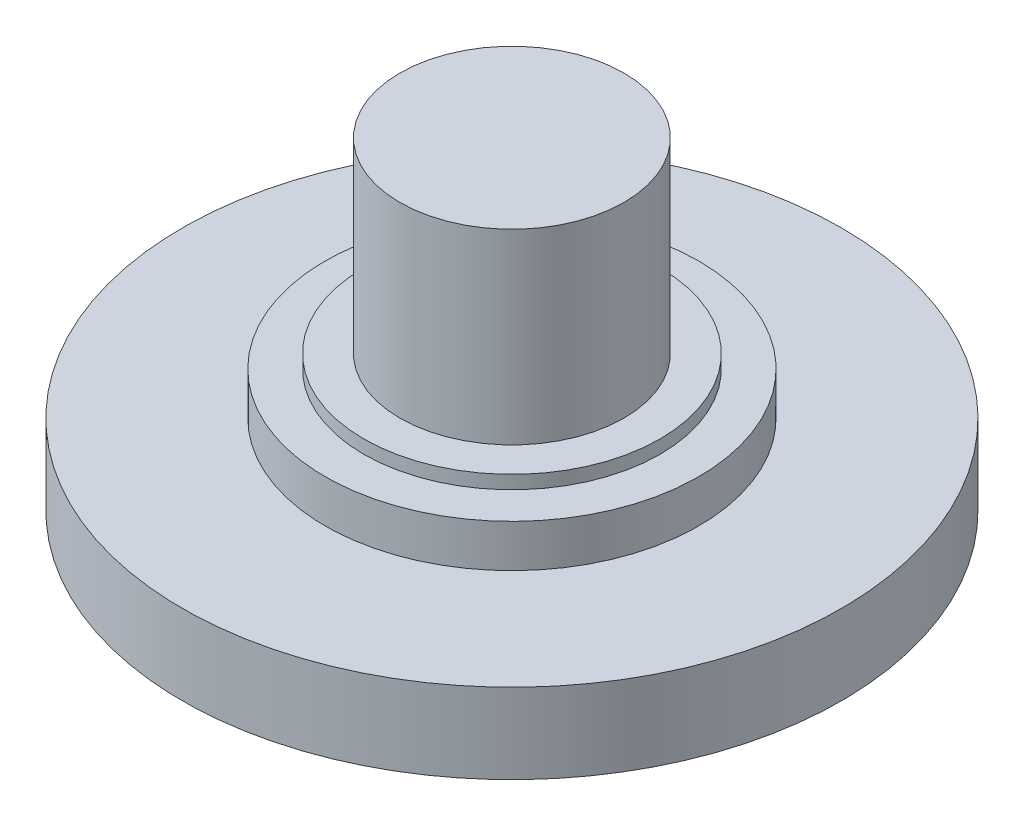
ISO-10303-21;
HEADER;
FILE_DESCRIPTION(('STEP AP214'),'2;1');
FILE_NAME('part.step','',(''),(''),'','','');
FILE_SCHEMA(('AUTOMOTIVE_DESIGN { 1 0 10303 214 1 1 1 1 }'));
ENDSEC;
DATA;
#1=APPLICATION_CONTEXT('core data for automotive mechanical design processes');
#2=APPLICATION_PROTOCOL_DEFINITION('international standard','automotive_design',2000,#1);
#3=PRODUCT_CONTEXT('',#1,'mechanical');
#4=PRODUCT('Part','Part','',(#3));
#5=PRODUCT_RELATED_PRODUCT_CATEGORY('part','',(#4));
#6=PRODUCT_DEFINITION_FORMATION('','',#4);
#7=PRODUCT_DEFINITION_CONTEXT('part definition',#1,'design');
#8=PRODUCT_DEFINITION('design','',#6,#7);
#9=PRODUCT_DEFINITION_SHAPE('','',#8);
#10=(LENGTH_UNIT() NAMED_UNIT(*) SI_UNIT(.MILLI.,.METRE.));
#11=(NAMED_UNIT(*) PLANE_ANGLE_UNIT() SI_UNIT($,.RADIAN.));
#12=(NAMED_UNIT(*) SI_UNIT($,.STERADIAN.) SOLID_ANGLE_UNIT());
#13=UNCERTAINTY_MEASURE_WITH_UNIT(LENGTH_MEASURE(1.E-05),#10,'distance_accuracy_value','');
#14=(GEOMETRIC_REPRESENTATION_CONTEXT(3) GLOBAL_UNCERTAINTY_ASSIGNED_CONTEXT((#13)) GLOBAL_UNIT_ASSIGNED_CONTEXT((#10,
#11,#12)) REPRESENTATION_CONTEXT('',''));
#15=CARTESIAN_POINT('',(0.,0.,0.));
#16=DIRECTION('',(0.,0.,1.));
#17=DIRECTION('',(1.,0.,0.));
#18=AXIS2_PLACEMENT_3D('',#15,#16,#17);
#19=CARTESIAN_POINT('',(18.6367599502443,-44.6805647840532,0.));
#20=DIRECTION('',(0.,1.,0.));
#21=DIRECTION('',(0.,0.,1.));
#22=AXIS2_PLACEMENT_3D('',#19,#20,#21);
#23=PLANE('',#22);
#24=CARTESIAN_POINT('',(0.,-44.6805647840532,0.));
#25=DIRECTION('',(0.,-1.,0.));
#26=DIRECTION('',(0.,0.,-1.));
#27=AXIS2_PLACEMENT_3D('',#24,#25,#26);
#28=CIRCLE('',#27,18.6367599502443);
#29=CARTESIAN_POINT('',(0.,-44.6805647840532,-18.6367599502443));
#30=VERTEX_POINT('',#29);
#31=EDGE_CURVE('E10',#30,#30,#28,.T.);
#32=ORIENTED_EDGE('',*,*,#31,.T.);
#33=EDGE_LOOP('',(#32));
#34=FACE_BOUND('',#33,.T.);
#35=ADVANCED_FACE('F36',(#34),#23,.F.);
#36=CARTESIAN_POINT('',(0.,-62.1805647840532,0.));
#37=DIRECTION('',(0.,-1.,0.));
#38=DIRECTION('',(0.,0.,-1.));
#39=AXIS2_PLACEMENT_3D('',#36,#37,#38);
#40=CONICAL_SURFACE('',#39,23.,0.244346095279207);
#41=ORIENTED_EDGE('',*,*,#31,.F.);
#42=EDGE_LOOP('',(#41));
#43=FACE_BOUND('',#42,.T.);
#44=CARTESIAN_POINT('',(0.,-62.1805647840532,0.));
#45=DIRECTION('',(0.,-1.,0.));
#46=DIRECTION('',(0.,0.,-1.));
#47=AXIS2_PLACEMENT_3D('',#44,#45,#46);
#48=CIRCLE('',#47,23.);
#49=CARTESIAN_POINT('',(0.,-62.1805647840532,-23.));
#50=VERTEX_POINT('',#49);
#51=EDGE_CURVE('E44',#50,#50,#48,.T.);
#52=ORIENTED_EDGE('',*,*,#51,.T.);
#53=EDGE_LOOP('',(#52));
#54=FACE_BOUND('',#53,.T.);
#55=ADVANCED_FACE('F177',(#43,#54),#40,.F.);
#56=CARTESIAN_POINT('',(30.,-62.1805647840532,0.));
#57=DIRECTION('',(0.,1.,0.));
#58=DIRECTION('',(0.,0.,1.));
#59=AXIS2_PLACEMENT_3D('',#56,#57,#58);
#60=PLANE('',#59);
#61=ORIENTED_EDGE('',*,*,#51,.F.);
#62=EDGE_LOOP('',(#61));
#63=FACE_BOUND('',#62,.T.);
#64=CARTESIAN_POINT('',(0.,-62.1805647840532,0.));
#65=DIRECTION('',(0.,-1.,0.));
#66=DIRECTION('',(0.,0.,-1.));
#67=AXIS2_PLACEMENT_3D('',#64,#65,#66);
#68=CIRCLE('',#67,30.);
#69=CARTESIAN_POINT('',(0.,-62.1805647840532,-30.));
#70=VERTEX_POINT('',#69);
#71=EDGE_CURVE('E48',#70,#70,#68,.T.);
#72=ORIENTED_EDGE('',*,*,#71,.T.);
#73=EDGE_LOOP('',(#72));
#74=FACE_BOUND('',#73,.T.);
#75=ADVANCED_FACE('F173',(#63,#74),#60,.F.);
#76=CARTESIAN_POINT('',(0.,-78.0635105204873,0.));
#77=DIRECTION('',(0.,-1.,0.));
#78=DIRECTION('',(0.,0.,-1.));
#79=AXIS2_PLACEMENT_3D('',#76,#77,#78);
#80=CYLINDRICAL_SURFACE('',#79,30.);
#81=ORIENTED_EDGE('',*,*,#71,.F.);
#82=EDGE_LOOP('',(#81));
#83=FACE_BOUND('',#82,.T.);
#84=CARTESIAN_POINT('',(0.,-47.1805647840532,0.));
#85=DIRECTION('',(0.,-1.,0.));
#86=DIRECTION('',(0.,0.,-1.));
#87=AXIS2_PLACEMENT_3D('',#84,#85,#86);
#88=CIRCLE('',#87,30.);
#89=CARTESIAN_POINT('',(0.,-47.1805647840532,-30.));
#90=VERTEX_POINT('',#89);
#91=EDGE_CURVE('E52',#90,#90,#88,.T.);
#92=ORIENTED_EDGE('',*,*,#91,.T.);
#93=EDGE_LOOP('',(#92));
#94=FACE_BOUND('',#93,.T.);
#95=ADVANCED_FACE('F169',(#83,#94),#80,.T.);
#96=CARTESIAN_POINT('',(34.,-47.1805647840532,0.));
#97=DIRECTION('',(0.,1.,0.));
#98=DIRECTION('',(0.,0.,1.));
#99=AXIS2_PLACEMENT_3D('',#96,#97,#98);
#100=PLANE('',#99);
#101=ORIENTED_EDGE('',*,*,#91,.F.);
#102=EDGE_LOOP('',(#101));
#103=FACE_BOUND('',#102,.T.);
#104=CARTESIAN_POINT('',(0.,-47.1805647840531,0.));
#105=DIRECTION('',(0.,-1.,0.));
#106=DIRECTION('',(0.,0.,-1.));
#107=AXIS2_PLACEMENT_3D('',#104,#105,#106);
#108=CIRCLE('',#107,34.);
#109=CARTESIAN_POINT('',(0.,-47.1805647840531,-34.));
#110=VERTEX_POINT('',#109);
#111=EDGE_CURVE('E57',#110,#110,#108,.T.);
#112=ORIENTED_EDGE('',*,*,#111,.T.);
#113=EDGE_LOOP('',(#112));
#114=FACE_BOUND('',#113,.T.);
#115=ADVANCED_FACE('F165',(#103,#114),#100,.F.);
#116=CARTESIAN_POINT('',(0.,-78.0635105204873,0.));
#117=DIRECTION('',(0.,-1.,0.));
#118=DIRECTION('',(0.,0.,-1.));
#119=AXIS2_PLACEMENT_3D('',#116,#117,#118);
#120=CYLINDRICAL_SURFACE('',#119,34.);
#121=ORIENTED_EDGE('',*,*,#111,.F.);
#122=EDGE_LOOP('',(#121));
#123=FACE_BOUND('',#122,.T.);
#124=CARTESIAN_POINT('',(0.,-41.1805647840531,0.));
#125=DIRECTION('',(0.,-1.,0.));
#126=DIRECTION('',(0.,0.,-1.));
#127=AXIS2_PLACEMENT_3D('',#124,#125,#126);
#128=CIRCLE('',#127,34.);
#129=CARTESIAN_POINT('',(0.,-41.1805647840531,-34.));
#130=VERTEX_POINT('',#129);
#131=EDGE_CURVE('E60',#130,#130,#128,.T.);
#132=ORIENTED_EDGE('',*,*,#131,.T.);
#133=EDGE_LOOP('',(#132));
#134=FACE_BOUND('',#133,.T.);
#135=ADVANCED_FACE('F161',(#123,#134),#120,.T.);
#136=CARTESIAN_POINT('',(61.75,-41.1805647840531,0.));
#137=DIRECTION('',(0.,1.,0.));
#138=DIRECTION('',(0.,0.,1.));
#139=AXIS2_PLACEMENT_3D('',#136,#137,#138);
#140=PLANE('',#139);
#141=ORIENTED_EDGE('',*,*,#131,.F.);
#142=EDGE_LOOP('',(#141));
#143=FACE_BOUND('',#142,.T.);
#144=CARTESIAN_POINT('',(0.,-41.1805647840531,0.));
#145=DIRECTION('',(0.,-1.,0.));
#146=DIRECTION('',(0.,0.,-1.));
#147=AXIS2_PLACEMENT_3D('',#144,#145,#146);
#148=CIRCLE('',#147,61.75);
#149=CARTESIAN_POINT('',(0.,-41.1805647840531,-61.75));
#150=VERTEX_POINT('',#149);
#151=EDGE_CURVE('E63',#150,#150,#148,.T.);
#152=ORIENTED_EDGE('',*,*,#151,.T.);
#153=EDGE_LOOP('',(#152));
#154=FACE_BOUND('',#153,.T.);
#155=ADVANCED_FACE('F157',(#143,#154),#140,.F.);
#156=CARTESIAN_POINT('',(0.,-78.0635105204873,0.));
#157=DIRECTION('',(0.,-1.,0.));
#158=DIRECTION('',(0.,0.,-1.));
#159=AXIS2_PLACEMENT_3D('',#156,#157,#158);
#160=CYLINDRICAL_SURFACE('',#159,61.75);
#161=ORIENTED_EDGE('',*,*,#151,.F.);
#162=EDGE_LOOP('',(#161));
#163=FACE_BOUND('',#162,.T.);
#164=CARTESIAN_POINT('',(0.,-26.1805647840531,0.));
#165=DIRECTION('',(0.,-1.,0.));
#166=DIRECTION('',(0.,0.,-1.));
#167=AXIS2_PLACEMENT_3D('',#164,#165,#166);
#168=CIRCLE('',#167,61.75);
#169=CARTESIAN_POINT('',(0.,-26.1805647840531,-61.75));
#170=VERTEX_POINT('',#169);
#171=EDGE_CURVE('E66',#170,#170,#168,.T.);
#172=ORIENTED_EDGE('',*,*,#171,.T.);
#173=EDGE_LOOP('',(#172));
#174=FACE_BOUND('',#173,.T.);
#175=ADVANCED_FACE('F153',(#163,#174),#160,.T.);
#176=CARTESIAN_POINT('',(35.,-26.1805647840531,0.));
#177=DIRECTION('',(0.,-1.,0.));
#178=DIRECTION('',(0.,0.,-1.));
#179=AXIS2_PLACEMENT_3D('',#176,#177,#178);
#180=PLANE('',#179);
#181=ORIENTED_EDGE('',*,*,#171,.F.);
#182=EDGE_LOOP('',(#181));
#183=FACE_BOUND('',#182,.T.);
#184=CARTESIAN_POINT('',(0.,-26.1805647840531,0.));
#185=DIRECTION('',(0.,-1.,0.));
#186=DIRECTION('',(0.,0.,-1.));
#187=AXIS2_PLACEMENT_3D('',#184,#185,#186);
#188=CIRCLE('',#187,35.);
#189=CARTESIAN_POINT('',(0.,-26.1805647840531,-35.));
#190=VERTEX_POINT('',#189);
#191=EDGE_CURVE('E69',#190,#190,#188,.T.);
#192=ORIENTED_EDGE('',*,*,#191,.T.);
#193=EDGE_LOOP('',(#192));
#194=FACE_BOUND('',#193,.T.);
#195=ADVANCED_FACE('F149',(#183,#194),#180,.F.);
#196=CARTESIAN_POINT('',(0.,-78.0635105204873,0.));
#197=DIRECTION('',(0.,-1.,0.));
#198=DIRECTION('',(0.,0.,-1.));
#199=AXIS2_PLACEMENT_3D('',#196,#197,#198);
#200=CYLINDRICAL_SURFACE('',#199,35.);
#201=ORIENTED_EDGE('',*,*,#191,.F.);
#202=EDGE_LOOP('',(#201));
#203=FACE_BOUND('',#202,.T.);
#204=CARTESIAN_POINT('',(0.,-18.1805647840531,0.));
#205=DIRECTION('',(0.,-1.,0.));
#206=DIRECTION('',(0.,0.,-1.));
#207=AXIS2_PLACEMENT_3D('',#204,#205,#206);
#208=CIRCLE('',#207,35.);
#209=CARTESIAN_POINT('',(0.,-18.1805647840531,-35.));
#210=VERTEX_POINT('',#209);
#211=EDGE_CURVE('E72',#210,#210,#208,.T.);
#212=ORIENTED_EDGE('',*,*,#211,.T.);
#213=EDGE_LOOP('',(#212));
#214=FACE_BOUND('',#213,.T.);
#215=ADVANCED_FACE('F145',(#203,#214),#200,.T.);
#216=CARTESIAN_POINT('',(27.75,-18.1805647840531,0.));
#217=DIRECTION('',(0.,-1.,0.));
#218=DIRECTION('',(0.,0.,-1.));
#219=AXIS2_PLACEMENT_3D('',#216,#217,#218);
#220=PLANE('',#219);
#221=ORIENTED_EDGE('',*,*,#211,.F.);
#222=EDGE_LOOP('',(#221));
#223=FACE_BOUND('',#222,.T.);
#224=CARTESIAN_POINT('',(0.,-18.1805647840531,0.));
#225=DIRECTION('',(0.,-1.,0.));
#226=DIRECTION('',(0.,0.,-1.));
#227=AXIS2_PLACEMENT_3D('',#224,#225,#226);
#228=CIRCLE('',#227,27.75);
#229=CARTESIAN_POINT('',(0.,-18.1805647840531,-27.75));
#230=VERTEX_POINT('',#229);
#231=EDGE_CURVE('E75',#230,#230,#228,.T.);
#232=ORIENTED_EDGE('',*,*,#231,.T.);
#233=EDGE_LOOP('',(#232));
#234=FACE_BOUND('',#233,.T.);
#235=ADVANCED_FACE('F141',(#223,#234),#220,.F.);
#236=CARTESIAN_POINT('',(0.,-78.0635105204873,0.));
#237=DIRECTION('',(0.,-1.,0.));
#238=DIRECTION('',(0.,0.,-1.));
#239=AXIS2_PLACEMENT_3D('',#236,#237,#238);
#240=CYLINDRICAL_SURFACE('',#239,27.75);
#241=ORIENTED_EDGE('',*,*,#231,.F.);
#242=EDGE_LOOP('',(#241));
#243=FACE_BOUND('',#242,.T.);
#244=CARTESIAN_POINT('',(0.,-15.6805647840531,0.));
#245=DIRECTION('',(0.,-1.,0.));
#246=DIRECTION('',(0.,0.,-1.));
#247=AXIS2_PLACEMENT_3D('',#244,#245,#246);
#248=CIRCLE('',#247,27.75);
#249=CARTESIAN_POINT('',(0.,-15.6805647840531,-27.75));
#250=VERTEX_POINT('',#249);
#251=EDGE_CURVE('E78',#250,#250,#248,.T.);
#252=ORIENTED_EDGE('',*,*,#251,.T.);
#253=EDGE_LOOP('',(#252));
#254=FACE_BOUND('',#253,.T.);
#255=ADVANCED_FACE('F137',(#243,#254),#240,.T.);
#256=CARTESIAN_POINT('',(21.,-15.6805647840531,0.));
#257=DIRECTION('',(0.,-1.,0.));
#258=DIRECTION('',(0.,0.,-1.));
#259=AXIS2_PLACEMENT_3D('',#256,#257,#258);
#260=PLANE('',#259);
#261=ORIENTED_EDGE('',*,*,#251,.F.);
#262=EDGE_LOOP('',(#261));
#263=FACE_BOUND('',#262,.T.);
#264=CARTESIAN_POINT('',(0.,-15.6805647840531,0.));
#265=DIRECTION('',(0.,-1.,0.));
#266=DIRECTION('',(0.,0.,-1.));
#267=AXIS2_PLACEMENT_3D('',#264,#265,#266);
#268=CIRCLE('',#267,21.);
#269=CARTESIAN_POINT('',(0.,-15.6805647840531,-21.));
#270=VERTEX_POINT('',#269);
#271=EDGE_CURVE('E81',#270,#270,#268,.T.);
#272=ORIENTED_EDGE('',*,*,#271,.T.);
#273=EDGE_LOOP('',(#272));
#274=FACE_BOUND('',#273,.T.);
#275=ADVANCED_FACE('F133',(#263,#274),#260,.F.);
#276=CARTESIAN_POINT('',(0.,-78.0635105204873,0.));
#277=DIRECTION('',(0.,-1.,0.));
#278=DIRECTION('',(0.,0.,-1.));
#279=AXIS2_PLACEMENT_3D('',#276,#277,#278);
#280=CYLINDRICAL_SURFACE('',#279,21.);
#281=ORIENTED_EDGE('',*,*,#271,.F.);
#282=EDGE_LOOP('',(#281));
#283=FACE_BOUND('',#282,.T.);
#284=CARTESIAN_POINT('',(0.,19.3194352159469,0.));
#285=DIRECTION('',(0.,-1.,0.));
#286=DIRECTION('',(0.,0.,-1.));
#287=AXIS2_PLACEMENT_3D('',#284,#285,#286);
#288=CIRCLE('',#287,21.);
#289=CARTESIAN_POINT('',(0.,19.3194352159469,-21.));
#290=VERTEX_POINT('',#289);
#291=EDGE_CURVE('E84',#290,#290,#288,.T.);
#292=ORIENTED_EDGE('',*,*,#291,.T.);
#293=EDGE_LOOP('',(#292));
#294=FACE_BOUND('',#293,.T.);
#295=ADVANCED_FACE('F129',(#283,#294),#280,.T.);
#296=CARTESIAN_POINT('',(0.,19.3194352159469,0.));
#297=DIRECTION('',(0.,-1.,0.));
#298=DIRECTION('',(0.,0.,-1.));
#299=AXIS2_PLACEMENT_3D('',#296,#297,#298);
#300=PLANE('',#299);
#301=ORIENTED_EDGE('',*,*,#291,.F.);
#302=EDGE_LOOP('',(#301));
#303=FACE_BOUND('',#302,.T.);
#304=ADVANCED_FACE('F127',(#303),#300,.F.);
#305=CLOSED_SHELL('',(#35,#55,#75,#95,#115,#135,#155,#175,#195,#215,#235,#255,#275,#295,#304));
#306=CARTESIAN_POINT('',(18.6367599502443,-34.6805647840532,0.));
#307=DIRECTION('',(0.,1.,0.));
#308=DIRECTION('',(0.,0.,1.));
#309=AXIS2_PLACEMENT_3D('',#306,#307,#308);
#310=PLANE('',#309);
#311=CARTESIAN_POINT('',(0.,-34.6805647840532,0.));
#312=DIRECTION('',(0.,-1.,0.));
#313=DIRECTION('',(0.,0.,-1.));
#314=AXIS2_PLACEMENT_3D('',#311,#312,#313);
#315=CIRCLE('',#314,25.);
#316=CARTESIAN_POINT('',(0.,-34.6805647840532,-25.));
#317=VERTEX_POINT('',#316);
#318=EDGE_CURVE('E102',#317,#317,#315,.T.);
#319=ORIENTED_EDGE('',*,*,#318,.F.);
#320=EDGE_LOOP('',(#319));
#321=FACE_BOUND('',#320,.T.);
#322=ADVANCED_FACE('F38',(#321),#310,.T.);
#323=CARTESIAN_POINT('',(0.,9.31943521594685,0.));
#324=DIRECTION('',(0.,-1.,0.));
#325=DIRECTION('',(0.,0.,-1.));
#326=AXIS2_PLACEMENT_3D('',#323,#324,#325);
#327=PLANE('',#326);
#328=CARTESIAN_POINT('',(0.,9.31943521594686,0.));
#329=DIRECTION('',(0.,-1.,0.));
#330=DIRECTION('',(0.,0.,-1.));
#331=AXIS2_PLACEMENT_3D('',#328,#329,#330);
#332=CIRCLE('',#331,11.);
#333=CARTESIAN_POINT('',(0.,9.31943521594686,-11.));
#334=VERTEX_POINT('',#333);
#335=EDGE_CURVE('E87',#334,#334,#332,.T.);
#336=ORIENTED_EDGE('',*,*,#335,.T.);
#337=EDGE_LOOP('',(#336));
#338=FACE_BOUND('',#337,.T.);
#339=ADVANCED_FACE('F110',(#338),#327,.T.);
#340=CARTESIAN_POINT('',(0.,-78.0635105204873,0.));
#341=DIRECTION('',(0.,-1.,0.));
#342=DIRECTION('',(0.,0.,-1.));
#343=AXIS2_PLACEMENT_3D('',#340,#341,#342);
#344=CYLINDRICAL_SURFACE('',#343,11.);
#345=CARTESIAN_POINT('',(0.,-25.6805647840532,0.));
#346=DIRECTION('',(0.,-1.,0.));
#347=DIRECTION('',(0.,0.,-1.));
#348=AXIS2_PLACEMENT_3D('',#345,#346,#347);
#349=CIRCLE('',#348,11.);
#350=CARTESIAN_POINT('',(0.,-25.6805647840532,-11.));
#351=VERTEX_POINT('',#350);
#352=EDGE_CURVE('E90',#351,#351,#349,.T.);
#353=ORIENTED_EDGE('',*,*,#352,.T.);
#354=EDGE_LOOP('',(#353));
#355=FACE_BOUND('',#354,.T.);
#356=ORIENTED_EDGE('',*,*,#335,.F.);
#357=EDGE_LOOP('',(#356));
#358=FACE_BOUND('',#357,.T.);
#359=ADVANCED_FACE('F116',(#355,#358),#344,.F.);
#360=CARTESIAN_POINT('',(21.,-25.6805647840532,0.));
#361=DIRECTION('',(0.,-1.,0.));
#362=DIRECTION('',(0.,0.,-1.));
#363=AXIS2_PLACEMENT_3D('',#360,#361,#362);
#364=PLANE('',#363);
#365=CARTESIAN_POINT('',(0.,-25.6805647840532,0.));
#366=DIRECTION('',(0.,-1.,0.));
#367=DIRECTION('',(0.,0.,-1.));
#368=AXIS2_PLACEMENT_3D('',#365,#366,#367);
#369=CIRCLE('',#368,17.75);
#370=CARTESIAN_POINT('',(0.,-25.6805647840532,-17.75));
#371=VERTEX_POINT('',#370);
#372=EDGE_CURVE('E93',#371,#371,#369,.T.);
#373=ORIENTED_EDGE('',*,*,#372,.T.);
#374=EDGE_LOOP('',(#373));
#375=FACE_BOUND('',#374,.T.);
#376=ORIENTED_EDGE('',*,*,#352,.F.);
#377=EDGE_LOOP('',(#376));
#378=FACE_BOUND('',#377,.T.);
#379=ADVANCED_FACE('F122',(#375,#378),#364,.T.);
#380=CARTESIAN_POINT('',(0.,-78.0635105204873,0.));
#381=DIRECTION('',(0.,-1.,0.));
#382=DIRECTION('',(0.,0.,-1.));
#383=AXIS2_PLACEMENT_3D('',#380,#381,#382);
#384=CYLINDRICAL_SURFACE('',#383,17.75);
#385=CARTESIAN_POINT('',(0.,-28.1805647840531,0.));
#386=DIRECTION('',(0.,-1.,0.));
#387=DIRECTION('',(0.,0.,-1.));
#388=AXIS2_PLACEMENT_3D('',#385,#386,#387);
#389=CIRCLE('',#388,17.75);
#390=CARTESIAN_POINT('',(0.,-28.1805647840531,-17.75));
#391=VERTEX_POINT('',#390);
#392=EDGE_CURVE('E96',#391,#391,#389,.T.);
#393=ORIENTED_EDGE('',*,*,#392,.T.);
#394=EDGE_LOOP('',(#393));
#395=FACE_BOUND('',#394,.T.);
#396=ORIENTED_EDGE('',*,*,#372,.F.);
#397=EDGE_LOOP('',(#396));
#398=FACE_BOUND('',#397,.T.);
#399=ADVANCED_FACE('F263',(#395,#398),#384,.F.);
#400=CARTESIAN_POINT('',(27.75,-28.1805647840531,0.));
#401=DIRECTION('',(0.,-1.,0.));
#402=DIRECTION('',(0.,0.,-1.));
#403=AXIS2_PLACEMENT_3D('',#400,#401,#402);
#404=PLANE('',#403);
#405=CARTESIAN_POINT('',(0.,-28.1805647840531,0.));
#406=DIRECTION('',(0.,-1.,0.));
#407=DIRECTION('',(0.,0.,-1.));
#408=AXIS2_PLACEMENT_3D('',#405,#406,#407);
#409=CIRCLE('',#408,25.);
#410=CARTESIAN_POINT('',(0.,-28.1805647840531,-25.));
#411=VERTEX_POINT('',#410);
#412=EDGE_CURVE('E99',#411,#411,#409,.T.);
#413=ORIENTED_EDGE('',*,*,#412,.T.);
#414=EDGE_LOOP('',(#413));
#415=FACE_BOUND('',#414,.T.);
#416=ORIENTED_EDGE('',*,*,#392,.F.);
#417=EDGE_LOOP('',(#416));
#418=FACE_BOUND('',#417,.T.);
#419=ADVANCED_FACE('F272',(#415,#418),#404,.T.);
#420=CARTESIAN_POINT('',(0.,-78.0635105204873,0.));
#421=DIRECTION('',(0.,-1.,0.));
#422=DIRECTION('',(0.,0.,-1.));
#423=AXIS2_PLACEMENT_3D('',#420,#421,#422);
#424=CYLINDRICAL_SURFACE('',#423,25.);
#425=ORIENTED_EDGE('',*,*,#318,.T.);
#426=EDGE_LOOP('',(#425));
#427=FACE_BOUND('',#426,.T.);
#428=ORIENTED_EDGE('',*,*,#412,.F.);
#429=EDGE_LOOP('',(#428));
#430=FACE_BOUND('',#429,.T.);
#431=ADVANCED_FACE('F106',(#427,#430),#424,.F.);
#432=CLOSED_SHELL('',(#322,#339,#359,#379,#399,#419,#431));
#433=ORIENTED_CLOSED_SHELL('',*,#432,.T.);
#434=BREP_WITH_VOIDS('B2',#305,(#433));
#435=ADVANCED_BREP_SHAPE_REPRESENTATION('',(#18,#434),#14);
#436=SHAPE_DEFINITION_REPRESENTATION(#9,#435);
ENDSEC;
END-ISO-10303-21;
